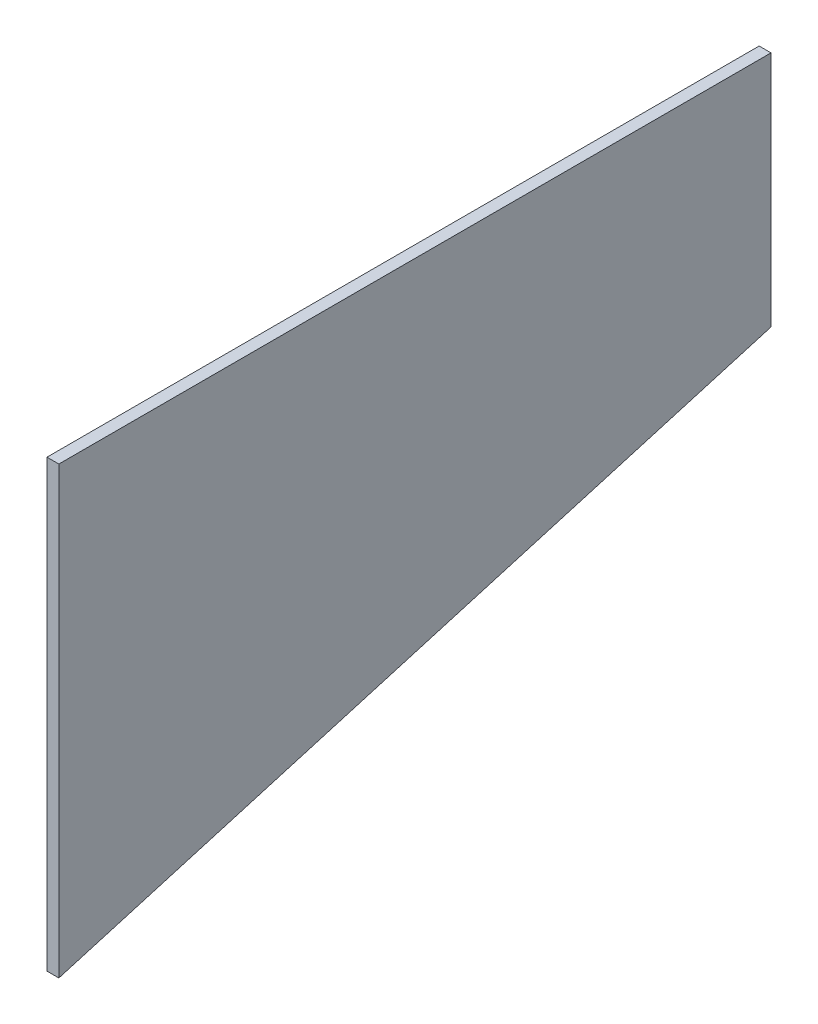
ISO-10303-21;
HEADER;
FILE_DESCRIPTION(('STEP AP214'),'2;1');
FILE_NAME('part.step','',(''),(''),'','','');
FILE_SCHEMA(('AUTOMOTIVE_DESIGN { 1 0 10303 214 1 1 1 1 }'));
ENDSEC;
DATA;
#1=APPLICATION_CONTEXT('core data for automotive mechanical design processes');
#2=APPLICATION_PROTOCOL_DEFINITION('international standard','automotive_design',2000,#1);
#3=PRODUCT_CONTEXT('',#1,'mechanical');
#4=PRODUCT('Part','Part','',(#3));
#5=PRODUCT_RELATED_PRODUCT_CATEGORY('part','',(#4));
#6=PRODUCT_DEFINITION_FORMATION('','',#4);
#7=PRODUCT_DEFINITION_CONTEXT('part definition',#1,'design');
#8=PRODUCT_DEFINITION('design','',#6,#7);
#9=PRODUCT_DEFINITION_SHAPE('','',#8);
#10=(LENGTH_UNIT() NAMED_UNIT(*) SI_UNIT(.MILLI.,.METRE.));
#11=(NAMED_UNIT(*) PLANE_ANGLE_UNIT() SI_UNIT($,.RADIAN.));
#12=(NAMED_UNIT(*) SI_UNIT($,.STERADIAN.) SOLID_ANGLE_UNIT());
#13=UNCERTAINTY_MEASURE_WITH_UNIT(LENGTH_MEASURE(1.E-05),#10,'distance_accuracy_value','');
#14=(GEOMETRIC_REPRESENTATION_CONTEXT(3) GLOBAL_UNCERTAINTY_ASSIGNED_CONTEXT((#13)) GLOBAL_UNIT_ASSIGNED_CONTEXT((#10,
#11,#12)) REPRESENTATION_CONTEXT('',''));
#15=CARTESIAN_POINT('',(0.,0.,0.));
#16=DIRECTION('',(0.,0.,1.));
#17=DIRECTION('',(1.,0.,0.));
#18=AXIS2_PLACEMENT_3D('',#15,#16,#17);
#19=CARTESIAN_POINT('',(2.,-40.,-120.));
#20=DIRECTION('',(0.,0.96,0.28));
#21=DIRECTION('',(0.,-0.28,0.96));
#22=AXIS2_PLACEMENT_3D('',#19,#20,#21);
#23=PLANE('',#22);
#24=DIRECTION('',(0.,0.28,-0.96));
#25=VECTOR('',#24,1.);
#26=CARTESIAN_POINT('',(0.,-40.,-120.));
#27=LINE('',#26,#25);
#28=CARTESIAN_POINT('',(0.,-75.,0.));
#29=VERTEX_POINT('',#28);
#30=CARTESIAN_POINT('',(0.,-40.,-120.));
#31=VERTEX_POINT('',#30);
#32=EDGE_CURVE('E96',#29,#31,#27,.T.);
#33=ORIENTED_EDGE('',*,*,#32,.T.);
#34=DIRECTION('',(-1.,0.,0.));
#35=VECTOR('',#34,1.);
#36=CARTESIAN_POINT('',(2.,-40.,-120.));
#37=LINE('',#36,#35);
#38=CARTESIAN_POINT('',(2.,-40.,-120.));
#39=VERTEX_POINT('',#38);
#40=EDGE_CURVE('E11',#39,#31,#37,.T.);
#41=ORIENTED_EDGE('',*,*,#40,.F.);
#42=DIRECTION('',(0.,0.28,-0.96));
#43=VECTOR('',#42,1.);
#44=CARTESIAN_POINT('',(2.,-40.,-120.));
#45=LINE('',#44,#43);
#46=CARTESIAN_POINT('',(2.,-75.,0.));
#47=VERTEX_POINT('',#46);
#48=EDGE_CURVE('E84',#47,#39,#45,.T.);
#49=ORIENTED_EDGE('',*,*,#48,.F.);
#50=DIRECTION('',(-1.,0.,0.));
#51=VECTOR('',#50,1.);
#52=CARTESIAN_POINT('',(2.,-75.,0.));
#53=LINE('',#52,#51);
#54=EDGE_CURVE('E92',#47,#29,#53,.T.);
#55=ORIENTED_EDGE('',*,*,#54,.T.);
#56=EDGE_LOOP('',(#33,#41,#49,#55));
#57=FACE_BOUND('',#56,.T.);
#58=ADVANCED_FACE('F33',(#57),#23,.F.);
#59=CARTESIAN_POINT('',(2.,0.,-120.));
#60=DIRECTION('',(0.,0.,1.));
#61=DIRECTION('',(1.,0.,0.));
#62=AXIS2_PLACEMENT_3D('',#59,#60,#61);
#63=PLANE('',#62);
#64=DIRECTION('',(0.,1.,0.));
#65=VECTOR('',#64,1.);
#66=CARTESIAN_POINT('',(0.,0.,-120.));
#67=LINE('',#66,#65);
#68=CARTESIAN_POINT('',(0.,0.,-120.));
#69=VERTEX_POINT('',#68);
#70=EDGE_CURVE('E88',#31,#69,#67,.T.);
#71=ORIENTED_EDGE('',*,*,#70,.T.);
#72=DIRECTION('',(-1.,0.,0.));
#73=VECTOR('',#72,1.);
#74=CARTESIAN_POINT('',(2.,0.,-120.));
#75=LINE('',#74,#73);
#76=CARTESIAN_POINT('',(2.,0.,-120.));
#77=VERTEX_POINT('',#76);
#78=EDGE_CURVE('E41',#77,#69,#75,.T.);
#79=ORIENTED_EDGE('',*,*,#78,.F.);
#80=DIRECTION('',(0.,1.,0.));
#81=VECTOR('',#80,1.);
#82=CARTESIAN_POINT('',(2.,0.,-120.));
#83=LINE('',#82,#81);
#84=EDGE_CURVE('E79',#39,#77,#83,.T.);
#85=ORIENTED_EDGE('',*,*,#84,.F.);
#86=ORIENTED_EDGE('',*,*,#40,.T.);
#87=EDGE_LOOP('',(#71,#79,#85,#86));
#88=FACE_BOUND('',#87,.T.);
#89=ADVANCED_FACE('F87',(#88),#63,.F.);
#90=CARTESIAN_POINT('',(2.,0.,0.));
#91=DIRECTION('',(0.,-1.,0.));
#92=DIRECTION('',(0.,0.,-1.));
#93=AXIS2_PLACEMENT_3D('',#90,#91,#92);
#94=PLANE('',#93);
#95=DIRECTION('',(0.,0.,1.));
#96=VECTOR('',#95,1.);
#97=CARTESIAN_POINT('',(0.,0.,0.));
#98=LINE('',#97,#96);
#99=CARTESIAN_POINT('',(0.,0.,0.));
#100=VERTEX_POINT('',#99);
#101=EDGE_CURVE('E66',#69,#100,#98,.T.);
#102=ORIENTED_EDGE('',*,*,#101,.T.);
#103=DIRECTION('',(-1.,0.,0.));
#104=VECTOR('',#103,1.);
#105=CARTESIAN_POINT('',(2.,0.,0.));
#106=LINE('',#105,#104);
#107=CARTESIAN_POINT('',(2.,0.,0.));
#108=VERTEX_POINT('',#107);
#109=EDGE_CURVE('E89',#108,#100,#106,.T.);
#110=ORIENTED_EDGE('',*,*,#109,.F.);
#111=DIRECTION('',(0.,0.,1.));
#112=VECTOR('',#111,1.);
#113=CARTESIAN_POINT('',(2.,0.,0.));
#114=LINE('',#113,#112);
#115=EDGE_CURVE('E82',#77,#108,#114,.T.);
#116=ORIENTED_EDGE('',*,*,#115,.F.);
#117=ORIENTED_EDGE('',*,*,#78,.T.);
#118=EDGE_LOOP('',(#102,#110,#116,#117));
#119=FACE_BOUND('',#118,.T.);
#120=ADVANCED_FACE('F90',(#119),#94,.F.);
#121=CARTESIAN_POINT('',(2.,-75.,0.));
#122=DIRECTION('',(0.,0.,-1.));
#123=DIRECTION('',(-1.,0.,0.));
#124=AXIS2_PLACEMENT_3D('',#121,#122,#123);
#125=PLANE('',#124);
#126=DIRECTION('',(0.,-1.,0.));
#127=VECTOR('',#126,1.);
#128=CARTESIAN_POINT('',(0.,-75.,0.));
#129=LINE('',#128,#127);
#130=EDGE_CURVE('E72',#100,#29,#129,.T.);
#131=ORIENTED_EDGE('',*,*,#130,.T.);
#132=ORIENTED_EDGE('',*,*,#54,.F.);
#133=DIRECTION('',(0.,-1.,0.));
#134=VECTOR('',#133,1.);
#135=CARTESIAN_POINT('',(2.,-75.,0.));
#136=LINE('',#135,#134);
#137=EDGE_CURVE('E49',#108,#47,#136,.T.);
#138=ORIENTED_EDGE('',*,*,#137,.F.);
#139=ORIENTED_EDGE('',*,*,#109,.T.);
#140=EDGE_LOOP('',(#131,#132,#138,#139));
#141=FACE_BOUND('',#140,.T.);
#142=ADVANCED_FACE('F103',(#141),#125,.F.);
#143=CARTESIAN_POINT('',(2.,0.,0.));
#144=DIRECTION('',(-1.,0.,0.));
#145=DIRECTION('',(0.,0.,1.));
#146=AXIS2_PLACEMENT_3D('',#143,#144,#145);
#147=PLANE('',#146);
#148=ORIENTED_EDGE('',*,*,#48,.T.);
#149=ORIENTED_EDGE('',*,*,#84,.T.);
#150=ORIENTED_EDGE('',*,*,#115,.T.);
#151=ORIENTED_EDGE('',*,*,#137,.T.);
#152=EDGE_LOOP('',(#148,#149,#150,#151));
#153=FACE_BOUND('',#152,.T.);
#154=ADVANCED_FACE('F80',(#153),#147,.F.);
#155=CARTESIAN_POINT('',(0.,0.,0.));
#156=DIRECTION('',(-1.,0.,0.));
#157=DIRECTION('',(0.,0.,1.));
#158=AXIS2_PLACEMENT_3D('',#155,#156,#157);
#159=PLANE('',#158);
#160=ORIENTED_EDGE('',*,*,#32,.F.);
#161=ORIENTED_EDGE('',*,*,#130,.F.);
#162=ORIENTED_EDGE('',*,*,#101,.F.);
#163=ORIENTED_EDGE('',*,*,#70,.F.);
#164=EDGE_LOOP('',(#160,#161,#162,#163));
#165=FACE_BOUND('',#164,.T.);
#166=ADVANCED_FACE('F106',(#165),#159,.T.);
#167=CLOSED_SHELL('',(#58,#89,#120,#142,#154,#166));
#168=MANIFOLD_SOLID_BREP('B2',#167);
#169=ADVANCED_BREP_SHAPE_REPRESENTATION('',(#18,#168),#14);
#170=SHAPE_DEFINITION_REPRESENTATION(#9,#169);
ENDSEC;
END-ISO-10303-21;
